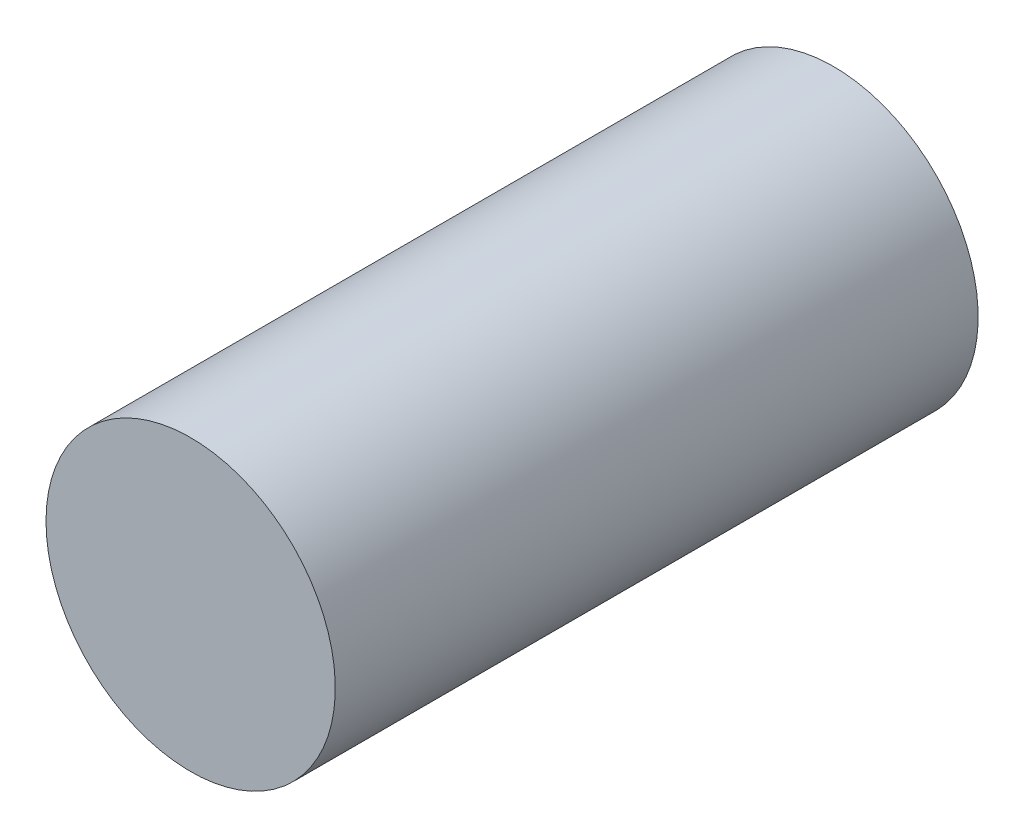
ISO-10303-21;
HEADER;
FILE_DESCRIPTION(('STEP AP214'),'2;1');
FILE_NAME('part.step','',(''),(''),'','','');
FILE_SCHEMA(('AUTOMOTIVE_DESIGN { 1 0 10303 214 1 1 1 1 }'));
ENDSEC;
DATA;
#1=APPLICATION_CONTEXT('core data for automotive mechanical design processes');
#2=APPLICATION_PROTOCOL_DEFINITION('international standard','automotive_design',2000,#1);
#3=PRODUCT_CONTEXT('',#1,'mechanical');
#4=PRODUCT('Part','Part','',(#3));
#5=PRODUCT_RELATED_PRODUCT_CATEGORY('part','',(#4));
#6=PRODUCT_DEFINITION_FORMATION('','',#4);
#7=PRODUCT_DEFINITION_CONTEXT('part definition',#1,'design');
#8=PRODUCT_DEFINITION('design','',#6,#7);
#9=PRODUCT_DEFINITION_SHAPE('','',#8);
#10=(LENGTH_UNIT() NAMED_UNIT(*) SI_UNIT(.MILLI.,.METRE.));
#11=(NAMED_UNIT(*) PLANE_ANGLE_UNIT() SI_UNIT($,.RADIAN.));
#12=(NAMED_UNIT(*) SI_UNIT($,.STERADIAN.) SOLID_ANGLE_UNIT());
#13=UNCERTAINTY_MEASURE_WITH_UNIT(LENGTH_MEASURE(1.E-05),#10,'distance_accuracy_value','');
#14=(GEOMETRIC_REPRESENTATION_CONTEXT(3) GLOBAL_UNCERTAINTY_ASSIGNED_CONTEXT((#13)) GLOBAL_UNIT_ASSIGNED_CONTEXT((#10,
#11,#12)) REPRESENTATION_CONTEXT('',''));
#15=CARTESIAN_POINT('',(0.,0.,0.));
#16=DIRECTION('',(0.,0.,1.));
#17=DIRECTION('',(1.,0.,0.));
#18=AXIS2_PLACEMENT_3D('',#15,#16,#17);
#19=CARTESIAN_POINT('',(89.742433907,581.154746165,0.));
#20=DIRECTION('',(0.,0.,1.));
#21=DIRECTION('',(1.,0.,0.));
#22=AXIS2_PLACEMENT_3D('',#19,#20,#21);
#23=PLANE('',#22);
#24=CARTESIAN_POINT('',(135.282433907,626.694746165,0.));
#25=DIRECTION('',(0.,0.,-1.));
#26=DIRECTION('',(-1.,0.,0.));
#27=AXIS2_PLACEMENT_3D('',#24,#25,#26);
#28=CIRCLE('',#27,45.);
#29=CARTESIAN_POINT('',(90.282433907,626.694746165,0.));
#30=VERTEX_POINT('',#29);
#31=EDGE_CURVE('E18',#30,#30,#28,.T.);
#32=ORIENTED_EDGE('',*,*,#31,.T.);
#33=EDGE_LOOP('',(#32));
#34=FACE_BOUND('',#33,.T.);
#35=ADVANCED_FACE('F14',(#34),#23,.F.);
#36=CARTESIAN_POINT('',(89.742433907,581.154746165,200.));
#37=DIRECTION('',(0.,0.,1.));
#38=DIRECTION('',(1.,0.,0.));
#39=AXIS2_PLACEMENT_3D('',#36,#37,#38);
#40=PLANE('',#39);
#41=CARTESIAN_POINT('',(135.282433907,626.694746165,200.));
#42=DIRECTION('',(0.,0.,-1.));
#43=DIRECTION('',(-1.,0.,0.));
#44=AXIS2_PLACEMENT_3D('',#41,#42,#43);
#45=CIRCLE('',#44,45.);
#46=CARTESIAN_POINT('',(90.282433907,626.694746165,200.));
#47=VERTEX_POINT('',#46);
#48=EDGE_CURVE('E9',#47,#47,#45,.F.);
#49=ORIENTED_EDGE('',*,*,#48,.T.);
#50=EDGE_LOOP('',(#49));
#51=FACE_BOUND('',#50,.T.);
#52=ADVANCED_FACE('F16',(#51),#40,.T.);
#53=CARTESIAN_POINT('',(135.282433907,626.694746165,200.));
#54=DIRECTION('',(0.,0.,-1.));
#55=DIRECTION('',(-1.,0.,0.));
#56=AXIS2_PLACEMENT_3D('',#53,#54,#55);
#57=CYLINDRICAL_SURFACE('',#56,45.);
#58=ORIENTED_EDGE('',*,*,#31,.F.);
#59=EDGE_LOOP('',(#58));
#60=FACE_BOUND('',#59,.T.);
#61=ORIENTED_EDGE('',*,*,#48,.F.);
#62=EDGE_LOOP('',(#61));
#63=FACE_BOUND('',#62,.T.);
#64=ADVANCED_FACE('F28',(#60,#63),#57,.T.);
#65=CLOSED_SHELL('',(#35,#52,#64));
#66=MANIFOLD_SOLID_BREP('B1',#65);
#67=ADVANCED_BREP_SHAPE_REPRESENTATION('',(#18,#66),#14);
#68=SHAPE_DEFINITION_REPRESENTATION(#9,#67);
ENDSEC;
END-ISO-10303-21;
